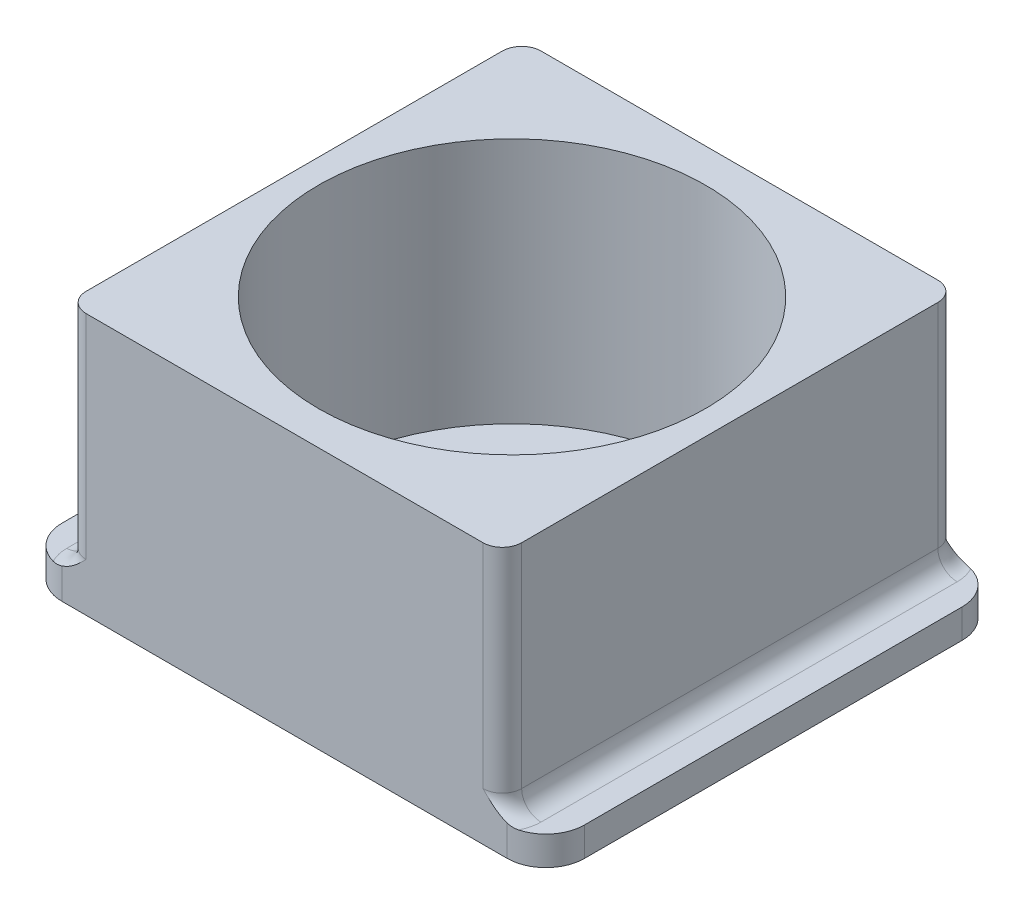
ISO-10303-21;
HEADER;
FILE_DESCRIPTION(('STEP AP214'),'2;1');
FILE_NAME('part.step','',(''),(''),'','','');
FILE_SCHEMA(('AUTOMOTIVE_DESIGN { 1 0 10303 214 1 1 1 1 }'));
ENDSEC;
DATA;
#1=APPLICATION_CONTEXT('core data for automotive mechanical design processes');
#2=APPLICATION_PROTOCOL_DEFINITION('international standard','automotive_design',2000,#1);
#3=PRODUCT_CONTEXT('',#1,'mechanical');
#4=PRODUCT('Part','Part','',(#3));
#5=PRODUCT_RELATED_PRODUCT_CATEGORY('part','',(#4));
#6=PRODUCT_DEFINITION_FORMATION('','',#4);
#7=PRODUCT_DEFINITION_CONTEXT('part definition',#1,'design');
#8=PRODUCT_DEFINITION('design','',#6,#7);
#9=PRODUCT_DEFINITION_SHAPE('','',#8);
#10=(LENGTH_UNIT() NAMED_UNIT(*) SI_UNIT(.MILLI.,.METRE.));
#11=(NAMED_UNIT(*) PLANE_ANGLE_UNIT() SI_UNIT($,.RADIAN.));
#12=(NAMED_UNIT(*) SI_UNIT($,.STERADIAN.) SOLID_ANGLE_UNIT());
#13=UNCERTAINTY_MEASURE_WITH_UNIT(LENGTH_MEASURE(1.E-05),#10,'distance_accuracy_value','');
#14=(GEOMETRIC_REPRESENTATION_CONTEXT(3) GLOBAL_UNCERTAINTY_ASSIGNED_CONTEXT((#13)) GLOBAL_UNIT_ASSIGNED_CONTEXT((#10,
#11,#12)) REPRESENTATION_CONTEXT('',''));
#15=CARTESIAN_POINT('',(0.,0.,0.));
#16=DIRECTION('',(0.,0.,1.));
#17=DIRECTION('',(1.,0.,0.));
#18=AXIS2_PLACEMENT_3D('',#15,#16,#17);
#19=CARTESIAN_POINT('',(0.,1.5,0.));
#20=DIRECTION('',(0.,-1.,0.));
#21=DIRECTION('',(0.,0.,-1.));
#22=AXIS2_PLACEMENT_3D('',#19,#20,#21);
#23=PLANE('',#22);
#24=DIRECTION('',(0.,0.,1.));
#25=VECTOR('',#24,1.);
#26=CARTESIAN_POINT('',(-24.5,1.5,-21.5));
#27=LINE('',#26,#25);
#28=CARTESIAN_POINT('',(-24.5,1.5,21.5));
#29=VERTEX_POINT('',#28);
#30=CARTESIAN_POINT('',(-24.5,1.5,-21.5));
#31=VERTEX_POINT('',#30);
#32=EDGE_CURVE('E264',#29,#31,#27,.F.);
#33=ORIENTED_EDGE('',*,*,#32,.T.);
#34=CARTESIAN_POINT('',(-20.5,1.5,-21.5));
#35=DIRECTION('',(0.,-1.,0.));
#36=DIRECTION('',(0.,0.,-1.));
#37=AXIS2_PLACEMENT_3D('',#34,#35,#36);
#38=CIRCLE('',#37,4.);
#39=CARTESIAN_POINT('',(-24.0399568640095,1.5,-23.3624460800119));
#40=VERTEX_POINT('',#39);
#41=EDGE_CURVE('E268',#31,#40,#38,.T.);
#42=ORIENTED_EDGE('',*,*,#41,.T.);
#43=CARTESIAN_POINT('',(-23.,1.5,-19.5));
#44=DIRECTION('',(0.,-1.,0.));
#45=DIRECTION('',(0.,0.,-1.));
#46=AXIS2_PLACEMENT_3D('',#43,#44,#45);
#47=CIRCLE('',#46,4.);
#48=CARTESIAN_POINT('',(-27.,1.5,-19.5));
#49=VERTEX_POINT('',#48);
#50=EDGE_CURVE('E246',#40,#49,#47,.F.);
#51=ORIENTED_EDGE('',*,*,#50,.T.);
#52=DIRECTION('',(0.,0.,1.));
#53=VECTOR('',#52,1.);
#54=CARTESIAN_POINT('',(-27.,1.5,23.5));
#55=LINE('',#54,#53);
#56=CARTESIAN_POINT('',(-27.,1.5,19.5));
#57=VERTEX_POINT('',#56);
#58=EDGE_CURVE('E216',#49,#57,#55,.T.);
#59=ORIENTED_EDGE('',*,*,#58,.T.);
#60=CARTESIAN_POINT('',(-23.,1.5,19.5));
#61=DIRECTION('',(0.,-1.,0.));
#62=DIRECTION('',(0.,0.,-1.));
#63=AXIS2_PLACEMENT_3D('',#60,#61,#62);
#64=CIRCLE('',#63,4.);
#65=CARTESIAN_POINT('',(-24.0399568640095,1.5,23.3624460800119));
#66=VERTEX_POINT('',#65);
#67=EDGE_CURVE('E248',#57,#66,#64,.F.);
#68=ORIENTED_EDGE('',*,*,#67,.T.);
#69=CARTESIAN_POINT('',(-20.5,1.5,21.5));
#70=DIRECTION('',(0.,-1.,0.));
#71=DIRECTION('',(0.,0.,-1.));
#72=AXIS2_PLACEMENT_3D('',#69,#70,#71);
#73=CIRCLE('',#72,4.);
#74=EDGE_CURVE('E266',#66,#29,#73,.T.);
#75=ORIENTED_EDGE('',*,*,#74,.T.);
#76=EDGE_LOOP('',(#33,#42,#51,#59,#68,#75));
#77=FACE_BOUND('',#76,.T.);
#78=ADVANCED_FACE('F39',(#77),#23,.F.);
#79=DIRECTION('',(0.,0.,-1.));
#80=VECTOR('',#79,1.);
#81=CARTESIAN_POINT('',(24.5,1.5,21.5));
#82=LINE('',#81,#80);
#83=CARTESIAN_POINT('',(24.5,1.5,-21.5));
#84=VERTEX_POINT('',#83);
#85=CARTESIAN_POINT('',(24.5,1.5,21.5));
#86=VERTEX_POINT('',#85);
#87=EDGE_CURVE('E273',#84,#86,#82,.F.);
#88=ORIENTED_EDGE('',*,*,#87,.T.);
#89=CARTESIAN_POINT('',(20.5,1.5,21.5));
#90=DIRECTION('',(0.,-1.,0.));
#91=DIRECTION('',(0.,0.,-1.));
#92=AXIS2_PLACEMENT_3D('',#89,#90,#91);
#93=CIRCLE('',#92,4.);
#94=CARTESIAN_POINT('',(24.0399568640095,1.5,23.3624460800119));
#95=VERTEX_POINT('',#94);
#96=EDGE_CURVE('E277',#86,#95,#93,.T.);
#97=ORIENTED_EDGE('',*,*,#96,.T.);
#98=CARTESIAN_POINT('',(23.,1.5,19.5));
#99=DIRECTION('',(0.,-1.,0.));
#100=DIRECTION('',(0.,0.,-1.));
#101=AXIS2_PLACEMENT_3D('',#98,#99,#100);
#102=CIRCLE('',#101,4.);
#103=CARTESIAN_POINT('',(27.,1.5,19.5));
#104=VERTEX_POINT('',#103);
#105=EDGE_CURVE('E251',#95,#104,#102,.F.);
#106=ORIENTED_EDGE('',*,*,#105,.T.);
#107=DIRECTION('',(0.,0.,-1.));
#108=VECTOR('',#107,1.);
#109=CARTESIAN_POINT('',(27.,1.5,23.5));
#110=LINE('',#109,#108);
#111=CARTESIAN_POINT('',(27.,1.5,-19.5));
#112=VERTEX_POINT('',#111);
#113=EDGE_CURVE('E213',#104,#112,#110,.T.);
#114=ORIENTED_EDGE('',*,*,#113,.T.);
#115=CARTESIAN_POINT('',(23.,1.5,-19.5));
#116=DIRECTION('',(0.,-1.,0.));
#117=DIRECTION('',(0.,0.,-1.));
#118=AXIS2_PLACEMENT_3D('',#115,#116,#117);
#119=CIRCLE('',#118,4.);
#120=CARTESIAN_POINT('',(24.0399568640095,1.5,-23.3624460800119));
#121=VERTEX_POINT('',#120);
#122=EDGE_CURVE('E243',#112,#121,#119,.F.);
#123=ORIENTED_EDGE('',*,*,#122,.T.);
#124=CARTESIAN_POINT('',(20.5,1.5,-21.5));
#125=DIRECTION('',(0.,-1.,0.));
#126=DIRECTION('',(0.,0.,-1.));
#127=AXIS2_PLACEMENT_3D('',#124,#125,#126);
#128=CIRCLE('',#127,4.);
#129=EDGE_CURVE('E275',#121,#84,#128,.T.);
#130=ORIENTED_EDGE('',*,*,#129,.T.);
#131=EDGE_LOOP('',(#88,#97,#106,#114,#123,#130));
#132=FACE_BOUND('',#131,.T.);
#133=ADVANCED_FACE('F420',(#132),#23,.F.);
#134=CARTESIAN_POINT('',(27.,1.5,23.5));
#135=DIRECTION('',(-1.,0.,0.));
#136=DIRECTION('',(0.,0.,1.));
#137=AXIS2_PLACEMENT_3D('',#134,#135,#136);
#138=PLANE('',#137);
#139=ORIENTED_EDGE('',*,*,#113,.F.);
#140=DIRECTION('',(0.,-1.,0.));
#141=VECTOR('',#140,1.);
#142=CARTESIAN_POINT('',(27.,1.5,19.5));
#143=LINE('',#142,#141);
#144=CARTESIAN_POINT('',(27.,-1.5,19.5));
#145=VERTEX_POINT('',#144);
#146=EDGE_CURVE('E228',#104,#145,#143,.T.);
#147=ORIENTED_EDGE('',*,*,#146,.T.);
#148=DIRECTION('',(0.,0.,-1.));
#149=VECTOR('',#148,1.);
#150=CARTESIAN_POINT('',(27.,-1.5,23.5));
#151=LINE('',#150,#149);
#152=CARTESIAN_POINT('',(27.,-1.5,-19.5));
#153=VERTEX_POINT('',#152);
#154=EDGE_CURVE('E204',#145,#153,#151,.T.);
#155=ORIENTED_EDGE('',*,*,#154,.T.);
#156=DIRECTION('',(0.,-1.,0.));
#157=VECTOR('',#156,1.);
#158=CARTESIAN_POINT('',(27.,1.5,-19.5));
#159=LINE('',#158,#157);
#160=EDGE_CURVE('E219',#153,#112,#159,.F.);
#161=ORIENTED_EDGE('',*,*,#160,.T.);
#162=EDGE_LOOP('',(#139,#147,#155,#161));
#163=FACE_BOUND('',#162,.T.);
#164=ADVANCED_FACE('F427',(#163),#138,.F.);
#165=CARTESIAN_POINT('',(-27.,1.5,-23.5));
#166=DIRECTION('',(0.,0.,1.));
#167=DIRECTION('',(1.,0.,0.));
#168=AXIS2_PLACEMENT_3D('',#165,#166,#167);
#169=PLANE('',#168);
#170=DIRECTION('',(-1.,0.,0.));
#171=VECTOR('',#170,1.);
#172=CARTESIAN_POINT('',(-27.,-1.5,-23.5));
#173=LINE('',#172,#171);
#174=CARTESIAN_POINT('',(23.,-1.5,-23.5));
#175=VERTEX_POINT('',#174);
#176=CARTESIAN_POINT('',(-23.,-1.5,-23.5));
#177=VERTEX_POINT('',#176);
#178=EDGE_CURVE('E207',#175,#177,#173,.T.);
#179=ORIENTED_EDGE('',*,*,#178,.T.);
#180=DIRECTION('',(0.,-1.,0.));
#181=VECTOR('',#180,1.);
#182=CARTESIAN_POINT('',(-23.,1.5,-23.5));
#183=LINE('',#182,#181);
#184=CARTESIAN_POINT('',(-23.,1.66628874963058,-23.5));
#185=VERTEX_POINT('',#184);
#186=EDGE_CURVE('E259',#177,#185,#183,.F.);
#187=ORIENTED_EDGE('',*,*,#186,.T.);
#188=CARTESIAN_POINT('',(-23.,1.66628874963058,-23.5));
#189=CARTESIAN_POINT('',(-22.8903338642382,1.70356250926023,-23.5));
#190=CARTESIAN_POINT('',(-22.7826803848652,1.74635232247954,-23.5));
#191=CARTESIAN_POINT('',(-22.5718897609288,1.84132053066929,-23.5));
#192=CARTESIAN_POINT('',(-22.4687423031175,1.89347592061837,-23.5));
#193=CARTESIAN_POINT('',(-22.2683174790698,2.00495052222373,-23.5));
#194=CARTESIAN_POINT('',(-22.1709786298475,2.06416060113332,-23.5));
#195=CARTESIAN_POINT('',(-21.9804356063367,2.18898314644126,-23.5));
#196=CARTESIAN_POINT('',(-21.88723407996,2.25459962943152,-23.5));
#197=CARTESIAN_POINT('',(-21.5635987666961,2.49631618751722,-23.5));
#198=CARTESIAN_POINT('',(-21.3437215683705,2.68642031146553,-23.5));
#199=CARTESIAN_POINT('',(-20.9179514379764,3.08218010252362,-23.5));
#200=CARTESIAN_POINT('',(-20.712111876492,3.28788945320796,-23.5));
#201=CARTESIAN_POINT('',(-20.5042163726082,3.49578362961498,-23.5));
#202=CARTESIAN_POINT('',(-20.5021081875281,3.49789181476138,-23.5));
#203=CARTESIAN_POINT('',(-20.5,3.5,-23.5));
#204=B_SPLINE_CURVE_WITH_KNOTS('',3,(#188,#189,#190,#191,#192,#193,#194,#195,#196,#197,#198,
#199,#200,#201,#202,#203),.UNSPECIFIED.,.F.,.F.,(4,2,2,2,2,2,2,4),(0.,0.347146339553688,
0.693451352811269,1.03496369302453,1.37669154158688,2.2466292117518,3.11970858153595,
3.12865285345887),.UNSPECIFIED.);
#205=CARTESIAN_POINT('',(-20.5,3.5,-23.5));
#206=VERTEX_POINT('',#205);
#207=EDGE_CURVE('E294',#185,#206,#204,.T.);
#208=ORIENTED_EDGE('',*,*,#207,.T.);
#209=DIRECTION('',(0.,-1.,0.));
#210=VECTOR('',#209,1.);
#211=CARTESIAN_POINT('',(-20.5,25.5,-23.5));
#212=LINE('',#211,#210);
#213=CARTESIAN_POINT('',(-20.5,25.5,-23.5));
#214=VERTEX_POINT('',#213);
#215=EDGE_CURVE('E370',#214,#206,#212,.T.);
#216=ORIENTED_EDGE('',*,*,#215,.F.);
#217=DIRECTION('',(-1.,0.,0.));
#218=VECTOR('',#217,1.);
#219=CARTESIAN_POINT('',(-20.5,25.5,-23.5));
#220=LINE('',#219,#218);
#221=CARTESIAN_POINT('',(20.5,25.5,-23.5));
#222=VERTEX_POINT('',#221);
#223=EDGE_CURVE('E350',#222,#214,#220,.T.);
#224=ORIENTED_EDGE('',*,*,#223,.F.);
#225=DIRECTION('',(0.,-1.,0.));
#226=VECTOR('',#225,1.);
#227=CARTESIAN_POINT('',(20.5,25.5,-23.5));
#228=LINE('',#227,#226);
#229=CARTESIAN_POINT('',(20.5,3.5,-23.5));
#230=VERTEX_POINT('',#229);
#231=EDGE_CURVE('E209',#222,#230,#228,.T.);
#232=ORIENTED_EDGE('',*,*,#231,.T.);
#233=CARTESIAN_POINT('',(23.,1.66628874963057,-23.5));
#234=CARTESIAN_POINT('',(22.8903338642376,1.7035625092604,-23.5));
#235=CARTESIAN_POINT('',(22.7826803848641,1.74635232247996,-23.5));
#236=CARTESIAN_POINT('',(22.5718897609268,1.84132053067026,-23.5));
#237=CARTESIAN_POINT('',(22.4687423031151,1.89347592061961,-23.5));
#238=CARTESIAN_POINT('',(22.2683174790676,2.00495052222504,-23.5));
#239=CARTESIAN_POINT('',(22.1709786298458,2.06416060113436,-23.5));
#240=CARTESIAN_POINT('',(21.980435606336,2.18898314644187,-23.5));
#241=CARTESIAN_POINT('',(21.8872340799598,2.254599629432,-23.5));
#242=CARTESIAN_POINT('',(21.5635987666958,2.49631618751664,-23.5));
#243=CARTESIAN_POINT('',(21.3437215683678,2.68642031146232,-23.5));
#244=CARTESIAN_POINT('',(20.9179514379797,3.08218010252629,-23.5));
#245=CARTESIAN_POINT('',(20.7121118765035,3.28788945321918,-23.5));
#246=CARTESIAN_POINT('',(20.5042163726085,3.49578362961522,-23.5));
#247=CARTESIAN_POINT('',(20.5021081875282,3.4978918147615,-23.5));
#248=CARTESIAN_POINT('',(20.5,3.5,-23.5));
#249=B_SPLINE_CURVE_WITH_KNOTS('',3,(#233,#234,#235,#236,#237,#238,#239,#240,#241,#242,#243,
#244,#245,#246,#247,#248),.UNSPECIFIED.,.F.,.F.,(4,2,2,2,2,2,2,4),(0.,0.347146339555444,
0.693451352814415,1.034963693026,1.37669154158688,2.24662921175119,3.11970858153597,
3.12865285345887),.UNSPECIFIED.);
#250=CARTESIAN_POINT('',(23.,1.66628874963057,-23.5));
#251=VERTEX_POINT('',#250);
#252=EDGE_CURVE('E49',#230,#251,#249,.F.);
#253=ORIENTED_EDGE('',*,*,#252,.T.);
#254=DIRECTION('',(0.,-1.,0.));
#255=VECTOR('',#254,1.);
#256=CARTESIAN_POINT('',(23.,1.5,-23.5));
#257=LINE('',#256,#255);
#258=EDGE_CURVE('E56',#251,#175,#257,.T.);
#259=ORIENTED_EDGE('',*,*,#258,.T.);
#260=EDGE_LOOP('',(#179,#187,#208,#216,#224,#232,#253,#259));
#261=FACE_BOUND('',#260,.T.);
#262=ADVANCED_FACE('F377',(#261),#169,.F.);
#263=CARTESIAN_POINT('',(-27.,1.5,23.5));
#264=DIRECTION('',(1.,0.,0.));
#265=DIRECTION('',(0.,0.,-1.));
#266=AXIS2_PLACEMENT_3D('',#263,#264,#265);
#267=PLANE('',#266);
#268=DIRECTION('',(0.,0.,1.));
#269=VECTOR('',#268,1.);
#270=CARTESIAN_POINT('',(-27.,-1.5,23.5));
#271=LINE('',#270,#269);
#272=CARTESIAN_POINT('',(-27.,-1.5,-19.5));
#273=VERTEX_POINT('',#272);
#274=CARTESIAN_POINT('',(-27.,-1.5,19.5));
#275=VERTEX_POINT('',#274);
#276=EDGE_CURVE('E223',#273,#275,#271,.T.);
#277=ORIENTED_EDGE('',*,*,#276,.T.);
#278=DIRECTION('',(0.,-1.,0.));
#279=VECTOR('',#278,1.);
#280=CARTESIAN_POINT('',(-27.,1.5,19.5));
#281=LINE('',#280,#279);
#282=EDGE_CURVE('E256',#275,#57,#281,.F.);
#283=ORIENTED_EDGE('',*,*,#282,.T.);
#284=ORIENTED_EDGE('',*,*,#58,.F.);
#285=DIRECTION('',(0.,-1.,0.));
#286=VECTOR('',#285,1.);
#287=CARTESIAN_POINT('',(-27.,1.5,-19.5));
#288=LINE('',#287,#286);
#289=EDGE_CURVE('E253',#49,#273,#288,.T.);
#290=ORIENTED_EDGE('',*,*,#289,.T.);
#291=EDGE_LOOP('',(#277,#283,#284,#290));
#292=FACE_BOUND('',#291,.T.);
#293=ADVANCED_FACE('F442',(#292),#267,.F.);
#294=CARTESIAN_POINT('',(-27.,1.5,23.5));
#295=DIRECTION('',(0.,0.,-1.));
#296=DIRECTION('',(-1.,0.,0.));
#297=AXIS2_PLACEMENT_3D('',#294,#295,#296);
#298=PLANE('',#297);
#299=DIRECTION('',(1.,0.,0.));
#300=VECTOR('',#299,1.);
#301=CARTESIAN_POINT('',(-27.,-1.5,23.5));
#302=LINE('',#301,#300);
#303=CARTESIAN_POINT('',(-23.,-1.5,23.5));
#304=VERTEX_POINT('',#303);
#305=CARTESIAN_POINT('',(23.,-1.5,23.5));
#306=VERTEX_POINT('',#305);
#307=EDGE_CURVE('E217',#304,#306,#302,.T.);
#308=ORIENTED_EDGE('',*,*,#307,.T.);
#309=DIRECTION('',(0.,-1.,0.));
#310=VECTOR('',#309,1.);
#311=CARTESIAN_POINT('',(23.,1.5,23.5));
#312=LINE('',#311,#310);
#313=CARTESIAN_POINT('',(23.,1.66628874963058,23.5));
#314=VERTEX_POINT('',#313);
#315=EDGE_CURVE('E64',#306,#314,#312,.F.);
#316=ORIENTED_EDGE('',*,*,#315,.T.);
#317=CARTESIAN_POINT('',(23.,1.66628874963058,23.5));
#318=CARTESIAN_POINT('',(22.8903338642357,1.70356250926099,23.5));
#319=CARTESIAN_POINT('',(22.7826803848604,1.74635232248141,23.5));
#320=CARTESIAN_POINT('',(22.57188976092,1.84132053067354,23.5));
#321=CARTESIAN_POINT('',(22.4687423031071,1.89347592062385,23.5));
#322=CARTESIAN_POINT('',(22.26831747906,2.00495052222951,23.5));
#323=CARTESIAN_POINT('',(22.1709786298398,2.06416060113788,23.5));
#324=CARTESIAN_POINT('',(21.9804356063334,2.18898314644396,23.5));
#325=CARTESIAN_POINT('',(21.887234079959,2.25459962943361,23.5));
#326=CARTESIAN_POINT('',(21.5635987666948,2.49631618751467,23.5));
#327=CARTESIAN_POINT('',(21.343721568359,2.68642031145144,23.5));
#328=CARTESIAN_POINT('',(20.9179514379907,3.0821801025353,23.5));
#329=CARTESIAN_POINT('',(20.7121118765425,3.2878894532572,23.4999999999999));
#330=CARTESIAN_POINT('',(20.5042163726092,3.495783629616,23.5));
#331=CARTESIAN_POINT('',(20.5021081875286,3.49789181476189,23.5));
#332=CARTESIAN_POINT('',(20.5,3.5,23.5));
#333=B_SPLINE_CURVE_WITH_KNOTS('',3,(#317,#318,#319,#320,#321,#322,#323,#324,#325,#326,#327,
#328,#329,#330,#331,#332),.UNSPECIFIED.,.F.,.F.,(4,2,2,2,2,2,2,4),(0.,0.34714633956139,
0.693451352825081,1.034963693031,1.37669154158687,2.24662921174907,3.11970858153593,
3.12865285345884),.UNSPECIFIED.);
#334=CARTESIAN_POINT('',(20.5,3.5,23.5));
#335=VERTEX_POINT('',#334);
#336=EDGE_CURVE('E385',#314,#335,#333,.T.);
#337=ORIENTED_EDGE('',*,*,#336,.T.);
#338=DIRECTION('',(0.,-1.,0.));
#339=VECTOR('',#338,1.);
#340=CARTESIAN_POINT('',(20.5,25.5,23.5));
#341=LINE('',#340,#339);
#342=CARTESIAN_POINT('',(20.5,25.5,23.5));
#343=VERTEX_POINT('',#342);
#344=EDGE_CURVE('E359',#343,#335,#341,.T.);
#345=ORIENTED_EDGE('',*,*,#344,.F.);
#346=DIRECTION('',(1.,0.,0.));
#347=VECTOR('',#346,1.);
#348=CARTESIAN_POINT('',(-20.5,25.5,23.5));
#349=LINE('',#348,#347);
#350=CARTESIAN_POINT('',(-20.5,25.5,23.5));
#351=VERTEX_POINT('',#350);
#352=EDGE_CURVE('E194',#351,#343,#349,.T.);
#353=ORIENTED_EDGE('',*,*,#352,.F.);
#354=DIRECTION('',(0.,-1.,0.));
#355=VECTOR('',#354,1.);
#356=CARTESIAN_POINT('',(-20.5,25.5,23.5));
#357=LINE('',#356,#355);
#358=CARTESIAN_POINT('',(-20.5,3.5,23.5));
#359=VERTEX_POINT('',#358);
#360=EDGE_CURVE('E361',#351,#359,#357,.T.);
#361=ORIENTED_EDGE('',*,*,#360,.T.);
#362=CARTESIAN_POINT('',(-23.,1.66628874963058,23.5));
#363=CARTESIAN_POINT('',(-22.8903338642362,1.70356250926084,23.5));
#364=CARTESIAN_POINT('',(-22.7826803848614,1.74635232248104,23.5));
#365=CARTESIAN_POINT('',(-22.5718897609218,1.8413205306727,23.5));
#366=CARTESIAN_POINT('',(-22.4687423031091,1.89347592062276,23.5));
#367=CARTESIAN_POINT('',(-22.268317479062,2.00495052222837,23.5));
#368=CARTESIAN_POINT('',(-22.1709786298413,2.06416060113697,23.5));
#369=CARTESIAN_POINT('',(-21.9804356063341,2.18898314644342,23.5));
#370=CARTESIAN_POINT('',(-21.8872340799592,2.25459962943319,23.5));
#371=CARTESIAN_POINT('',(-21.5635987666951,2.49631618751517,23.5));
#372=CARTESIAN_POINT('',(-21.3437215683612,2.68642031145423,23.5));
#373=CARTESIAN_POINT('',(-20.9179514379879,3.08218010253298,23.5));
#374=CARTESIAN_POINT('',(-20.7121118765325,3.28788945324743,23.4999999999999));
#375=CARTESIAN_POINT('',(-20.504216372609,3.4957836296158,23.5));
#376=CARTESIAN_POINT('',(-20.5021081875285,3.49789181476179,23.5));
#377=CARTESIAN_POINT('',(-20.5,3.5,23.5));
#378=B_SPLINE_CURVE_WITH_KNOTS('',3,(#362,#363,#364,#365,#366,#367,#368,#369,#370,#371,#372,
#373,#374,#375,#376,#377),.UNSPECIFIED.,.F.,.F.,(4,2,2,2,2,2,2,4),(0.,0.347146339559859,
0.693451352822337,1.03496369302971,1.37669154158687,2.24662921174961,3.11970858153593,
3.12865285345884),.UNSPECIFIED.);
#379=CARTESIAN_POINT('',(-23.,1.66628874963058,23.5));
#380=VERTEX_POINT('',#379);
#381=EDGE_CURVE('E496',#359,#380,#378,.F.);
#382=ORIENTED_EDGE('',*,*,#381,.T.);
#383=DIRECTION('',(0.,-1.,0.));
#384=VECTOR('',#383,1.);
#385=CARTESIAN_POINT('',(-23.,1.5,23.5));
#386=LINE('',#385,#384);
#387=EDGE_CURVE('E239',#380,#304,#386,.T.);
#388=ORIENTED_EDGE('',*,*,#387,.T.);
#389=EDGE_LOOP('',(#308,#316,#337,#345,#353,#361,#382,#388));
#390=FACE_BOUND('',#389,.T.);
#391=ADVANCED_FACE('F401',(#390),#298,.F.);
#392=CARTESIAN_POINT('',(0.,-1.5,0.));
#393=DIRECTION('',(0.,-1.,0.));
#394=DIRECTION('',(0.,0.,-1.));
#395=AXIS2_PLACEMENT_3D('',#392,#393,#394);
#396=PLANE('',#395);
#397=CARTESIAN_POINT('',(0.,-1.5,0.));
#398=DIRECTION('',(0.,1.,0.));
#399=DIRECTION('',(0.,0.,1.));
#400=AXIS2_PLACEMENT_3D('',#397,#398,#399);
#401=CIRCLE('',#400,10.);
#402=CARTESIAN_POINT('',(0.,-1.5,10.));
#403=VERTEX_POINT('',#402);
#404=EDGE_CURVE('E343',#403,#403,#401,.T.);
#405=ORIENTED_EDGE('',*,*,#404,.T.);
#406=EDGE_LOOP('',(#405));
#407=FACE_BOUND('',#406,.T.);
#408=ORIENTED_EDGE('',*,*,#154,.F.);
#409=CARTESIAN_POINT('',(23.,-1.5,19.5));
#410=DIRECTION('',(0.,-1.,0.));
#411=DIRECTION('',(0.,0.,-1.));
#412=AXIS2_PLACEMENT_3D('',#409,#410,#411);
#413=CIRCLE('',#412,4.);
#414=EDGE_CURVE('E237',#145,#306,#413,.T.);
#415=ORIENTED_EDGE('',*,*,#414,.T.);
#416=ORIENTED_EDGE('',*,*,#307,.F.);
#417=CARTESIAN_POINT('',(-23.,-1.5,19.5));
#418=DIRECTION('',(0.,-1.,0.));
#419=DIRECTION('',(0.,0.,-1.));
#420=AXIS2_PLACEMENT_3D('',#417,#418,#419);
#421=CIRCLE('',#420,4.);
#422=EDGE_CURVE('E235',#304,#275,#421,.T.);
#423=ORIENTED_EDGE('',*,*,#422,.T.);
#424=ORIENTED_EDGE('',*,*,#276,.F.);
#425=CARTESIAN_POINT('',(-23.,-1.5,-19.5));
#426=DIRECTION('',(0.,-1.,0.));
#427=DIRECTION('',(0.,0.,-1.));
#428=AXIS2_PLACEMENT_3D('',#425,#426,#427);
#429=CIRCLE('',#428,4.);
#430=EDGE_CURVE('E233',#273,#177,#429,.T.);
#431=ORIENTED_EDGE('',*,*,#430,.T.);
#432=ORIENTED_EDGE('',*,*,#178,.F.);
#433=CARTESIAN_POINT('',(23.,-1.5,-19.5));
#434=DIRECTION('',(0.,-1.,0.));
#435=DIRECTION('',(0.,0.,-1.));
#436=AXIS2_PLACEMENT_3D('',#433,#434,#435);
#437=CIRCLE('',#436,4.);
#438=EDGE_CURVE('E231',#175,#153,#437,.T.);
#439=ORIENTED_EDGE('',*,*,#438,.T.);
#440=EDGE_LOOP('',(#408,#415,#416,#423,#424,#431,#432,#439));
#441=FACE_BOUND('',#440,.T.);
#442=ADVANCED_FACE('F431',(#407,#441),#396,.T.);
#443=CARTESIAN_POINT('',(23.,1.5,19.5));
#444=DIRECTION('',(0.,-1.,0.));
#445=DIRECTION('',(0.,0.,-1.));
#446=AXIS2_PLACEMENT_3D('',#443,#444,#445);
#447=CYLINDRICAL_SURFACE('',#446,4.);
#448=ORIENTED_EDGE('',*,*,#105,.F.);
#449=CARTESIAN_POINT('',(24.0399568640095,1.5,23.3624460800119));
#450=CARTESIAN_POINT('',(23.9698240876217,1.50000001642399,23.3813436911759));
#451=CARTESIAN_POINT('',(23.8991559078275,1.50212890225138,23.3983082333179));
#452=CARTESIAN_POINT('',(23.7571940093544,1.51086009385949,23.4283452593107));
#453=CARTESIAN_POINT('',(23.6858997057404,1.51746715097721,23.4414135880551));
#454=CARTESIAN_POINT('',(23.5445480600626,1.53521234096278,23.4633950521013));
#455=CARTESIAN_POINT('',(23.4744912283006,1.546267950106,23.4723778367474));
#456=CARTESIAN_POINT('',(23.3349470337689,1.57309228579254,23.4865674270324));
#457=CARTESIAN_POINT('',(23.2654592384314,1.58885700728089,23.4917774285451));
#458=CARTESIAN_POINT('',(23.1635541159242,1.61577855705873,23.496791649555));
#459=CARTESIAN_POINT('',(23.1306946420752,1.62505365186932,23.497998066726));
#460=CARTESIAN_POINT('',(23.0651581132822,1.64478425512921,23.4996041819657));
#461=CARTESIAN_POINT('',(23.0324824485261,1.65524466363393,23.5000003919733));
#462=CARTESIAN_POINT('',(23.,1.66628874963037,23.5000000000001));
#463=B_SPLINE_CURVE_WITH_KNOTS('',3,(#449,#450,#451,#452,#453,#454,#455,#456,#457,#458,#459,
#460,#461,#462),.UNSPECIFIED.,.F.,.F.,(4,2,2,2,2,2,4),(0.,0.217866449812925,0.435964418396976,
0.650190438956059,0.86423477858804,0.966703106805048,1.06961165534549),.UNSPECIFIED.);
#464=EDGE_CURVE('E386',#95,#314,#463,.T.);
#465=ORIENTED_EDGE('',*,*,#464,.T.);
#466=ORIENTED_EDGE('',*,*,#315,.F.);
#467=ORIENTED_EDGE('',*,*,#414,.F.);
#468=ORIENTED_EDGE('',*,*,#146,.F.);
#469=EDGE_LOOP('',(#448,#465,#466,#467,#468));
#470=FACE_BOUND('',#469,.T.);
#471=ADVANCED_FACE('F433',(#470),#447,.T.);
#472=CARTESIAN_POINT('',(-23.,1.5,19.5));
#473=DIRECTION('',(0.,-1.,0.));
#474=DIRECTION('',(0.,0.,-1.));
#475=AXIS2_PLACEMENT_3D('',#472,#473,#474);
#476=CYLINDRICAL_SURFACE('',#475,4.);
#477=ORIENTED_EDGE('',*,*,#67,.F.);
#478=ORIENTED_EDGE('',*,*,#282,.F.);
#479=ORIENTED_EDGE('',*,*,#422,.F.);
#480=ORIENTED_EDGE('',*,*,#387,.F.);
#481=CARTESIAN_POINT('',(-23.,1.66628874963058,23.5));
#482=CARTESIAN_POINT('',(-23.0688006054759,1.64289347508008,23.5000175936537));
#483=CARTESIAN_POINT('',(-23.1384768491733,1.62211994641261,23.4982257322865));
#484=CARTESIAN_POINT('',(-23.2789508840957,1.58562999507363,23.4908764754229));
#485=CARTESIAN_POINT('',(-23.3497487095902,1.56991372723878,23.4853189646509));
#486=CARTESIAN_POINT('',(-23.4906412835135,1.54357588810128,23.4704176883739));
#487=CARTESIAN_POINT('',(-23.5607279297792,1.53287334764138,23.4611389387245));
#488=CARTESIAN_POINT('',(-23.7008050214607,1.51598400010114,23.4387683150824));
#489=CARTESIAN_POINT('',(-23.7707954976745,1.5097948991309,23.4256783828079));
#490=CARTESIAN_POINT('',(-23.8738291194858,1.50382866265353,23.4035353197646));
#491=CARTESIAN_POINT('',(-23.9071033031971,1.50239089167915,23.3959375585193));
#492=CARTESIAN_POINT('',(-23.973608279753,1.50047473533557,23.3798533311209));
#493=CARTESIAN_POINT('',(-24.006838338429,1.50000029816985,23.371363357035));
#494=CARTESIAN_POINT('',(-24.0399568640095,1.5,23.3624460800119));
#495=B_SPLINE_CURVE_WITH_KNOTS('',3,(#481,#482,#483,#484,#485,#486,#487,#488,#489,#490,#491,
#492,#493,#494),.UNSPECIFIED.,.F.,.F.,(4,2,2,2,2,2,4),(0.,0.217913203233139,0.435833077615348,
0.650100772083153,0.86425949207738,0.966721210010184,1.0696020243463),.UNSPECIFIED.);
#496=EDGE_CURVE('E388',#380,#66,#495,.T.);
#497=ORIENTED_EDGE('',*,*,#496,.T.);
#498=EDGE_LOOP('',(#477,#478,#479,#480,#497));
#499=FACE_BOUND('',#498,.T.);
#500=ADVANCED_FACE('F310',(#499),#476,.T.);
#501=CARTESIAN_POINT('',(-23.,1.5,-19.5));
#502=DIRECTION('',(0.,-1.,0.));
#503=DIRECTION('',(0.,0.,-1.));
#504=AXIS2_PLACEMENT_3D('',#501,#502,#503);
#505=CYLINDRICAL_SURFACE('',#504,4.);
#506=ORIENTED_EDGE('',*,*,#50,.F.);
#507=CARTESIAN_POINT('',(-24.0399568640095,1.5,-23.3624460800119));
#508=CARTESIAN_POINT('',(-23.9698240876217,1.50000001642399,-23.3813436911759));
#509=CARTESIAN_POINT('',(-23.8991559078275,1.50212890225138,-23.3983082333179));
#510=CARTESIAN_POINT('',(-23.7571940093544,1.51086009385949,-23.4283452593107));
#511=CARTESIAN_POINT('',(-23.6858997057404,1.51746715097722,-23.4414135880551));
#512=CARTESIAN_POINT('',(-23.5445480600625,1.53521234096278,-23.4633950521013));
#513=CARTESIAN_POINT('',(-23.4744912283006,1.546267950106,-23.4723778367474));
#514=CARTESIAN_POINT('',(-23.3349470337689,1.57309228579254,-23.4865674270324));
#515=CARTESIAN_POINT('',(-23.2654592384314,1.58885700728089,-23.4917774285451));
#516=CARTESIAN_POINT('',(-23.1635541159242,1.61577855705873,-23.496791649555));
#517=CARTESIAN_POINT('',(-23.1306946420752,1.62505365186932,-23.497998066726));
#518=CARTESIAN_POINT('',(-23.0651581132822,1.64478425512921,-23.4996041819657));
#519=CARTESIAN_POINT('',(-23.0324824485261,1.65524466363393,-23.5000003919733));
#520=CARTESIAN_POINT('',(-23.,1.66628874963037,-23.5000000000001));
#521=B_SPLINE_CURVE_WITH_KNOTS('',3,(#507,#508,#509,#510,#511,#512,#513,#514,#515,#516,#517,
#518,#519,#520),.UNSPECIFIED.,.F.,.F.,(4,2,2,2,2,2,4),(0.,0.217866449812925,0.435964418396983,
0.650190438956062,0.864234778588044,0.966703106805048,1.06961165534549),.UNSPECIFIED.);
#522=EDGE_CURVE('E285',#40,#185,#521,.T.);
#523=ORIENTED_EDGE('',*,*,#522,.T.);
#524=ORIENTED_EDGE('',*,*,#186,.F.);
#525=ORIENTED_EDGE('',*,*,#430,.F.);
#526=ORIENTED_EDGE('',*,*,#289,.F.);
#527=EDGE_LOOP('',(#506,#523,#524,#525,#526));
#528=FACE_BOUND('',#527,.T.);
#529=ADVANCED_FACE('F305',(#528),#505,.T.);
#530=CARTESIAN_POINT('',(23.,1.5,-19.5));
#531=DIRECTION('',(0.,-1.,0.));
#532=DIRECTION('',(0.,0.,-1.));
#533=AXIS2_PLACEMENT_3D('',#530,#531,#532);
#534=CYLINDRICAL_SURFACE('',#533,4.);
#535=ORIENTED_EDGE('',*,*,#122,.F.);
#536=ORIENTED_EDGE('',*,*,#160,.F.);
#537=ORIENTED_EDGE('',*,*,#438,.F.);
#538=ORIENTED_EDGE('',*,*,#258,.F.);
#539=CARTESIAN_POINT('',(23.,1.66628874963057,-23.5));
#540=CARTESIAN_POINT('',(23.0688006054759,1.64289347508007,-23.5000175936537));
#541=CARTESIAN_POINT('',(23.1384768491733,1.62211994641261,-23.4982257322865));
#542=CARTESIAN_POINT('',(23.2789508840957,1.58562999507363,-23.4908764754229));
#543=CARTESIAN_POINT('',(23.3497487095902,1.56991372723878,-23.4853189646509));
#544=CARTESIAN_POINT('',(23.4906412835135,1.54357588810128,-23.4704176883739));
#545=CARTESIAN_POINT('',(23.5607279297792,1.53287334764138,-23.4611389387245));
#546=CARTESIAN_POINT('',(23.7008050214607,1.51598400010113,-23.4387683150824));
#547=CARTESIAN_POINT('',(23.7707954976745,1.5097948991309,-23.4256783828079));
#548=CARTESIAN_POINT('',(23.8738291194858,1.50382866265353,-23.4035353197646));
#549=CARTESIAN_POINT('',(23.9071033031971,1.50239089167915,-23.3959375585193));
#550=CARTESIAN_POINT('',(23.973608279753,1.50047473533557,-23.3798533311209));
#551=CARTESIAN_POINT('',(24.006838338429,1.50000029816985,-23.371363357035));
#552=CARTESIAN_POINT('',(24.0399568640095,1.5,-23.3624460800119));
#553=B_SPLINE_CURVE_WITH_KNOTS('',3,(#539,#540,#541,#542,#543,#544,#545,#546,#547,#548,#549,
#550,#551,#552),.UNSPECIFIED.,.F.,.F.,(4,2,2,2,2,2,4),(0.,0.217913203233142,0.435833077615352,
0.650100772083153,0.864259492077379,0.966721210010173,1.06960202434629),.UNSPECIFIED.);
#554=EDGE_CURVE('E11',#251,#121,#553,.T.);
#555=ORIENTED_EDGE('',*,*,#554,.T.);
#556=EDGE_LOOP('',(#535,#536,#537,#538,#555));
#557=FACE_BOUND('',#556,.T.);
#558=ADVANCED_FACE('F309',(#557),#534,.T.);
#559=CARTESIAN_POINT('',(20.5,25.5,21.5));
#560=DIRECTION('',(0.,-1.,0.));
#561=DIRECTION('',(0.,0.,-1.));
#562=AXIS2_PLACEMENT_3D('',#559,#560,#561);
#563=CYLINDRICAL_SURFACE('',#562,2.);
#564=ORIENTED_EDGE('',*,*,#344,.T.);
#565=CARTESIAN_POINT('',(20.5,3.5,21.5));
#566=DIRECTION('',(0.,-1.,0.));
#567=DIRECTION('',(0.,0.,-1.));
#568=AXIS2_PLACEMENT_3D('',#565,#566,#567);
#569=CIRCLE('',#568,2.);
#570=CARTESIAN_POINT('',(22.5,3.5,21.5));
#571=VERTEX_POINT('',#570);
#572=EDGE_CURVE('E203',#335,#571,#569,.F.);
#573=ORIENTED_EDGE('',*,*,#572,.T.);
#574=DIRECTION('',(0.,-1.,0.));
#575=VECTOR('',#574,1.);
#576=CARTESIAN_POINT('',(22.5,25.5,21.5));
#577=LINE('',#576,#575);
#578=CARTESIAN_POINT('',(22.5,25.5,21.5));
#579=VERTEX_POINT('',#578);
#580=EDGE_CURVE('E183',#579,#571,#577,.T.);
#581=ORIENTED_EDGE('',*,*,#580,.F.);
#582=CARTESIAN_POINT('',(20.5,25.5,21.5));
#583=DIRECTION('',(0.,1.,0.));
#584=DIRECTION('',(0.,0.,1.));
#585=AXIS2_PLACEMENT_3D('',#582,#583,#584);
#586=CIRCLE('',#585,2.);
#587=EDGE_CURVE('E189',#343,#579,#586,.T.);
#588=ORIENTED_EDGE('',*,*,#587,.F.);
#589=EDGE_LOOP('',(#564,#573,#581,#588));
#590=FACE_BOUND('',#589,.T.);
#591=ADVANCED_FACE('F201',(#590),#563,.T.);
#592=CARTESIAN_POINT('',(22.5,25.5,21.5));
#593=DIRECTION('',(-1.,0.,0.));
#594=DIRECTION('',(0.,0.,1.));
#595=AXIS2_PLACEMENT_3D('',#592,#593,#594);
#596=PLANE('',#595);
#597=ORIENTED_EDGE('',*,*,#580,.T.);
#598=DIRECTION('',(0.,0.,-1.));
#599=VECTOR('',#598,1.);
#600=CARTESIAN_POINT('',(22.5,3.5,-21.5));
#601=LINE('',#600,#599);
#602=CARTESIAN_POINT('',(22.5,3.5,-21.5));
#603=VERTEX_POINT('',#602);
#604=EDGE_CURVE('E283',#571,#603,#601,.T.);
#605=ORIENTED_EDGE('',*,*,#604,.T.);
#606=DIRECTION('',(0.,-1.,0.));
#607=VECTOR('',#606,1.);
#608=CARTESIAN_POINT('',(22.5,25.5,-21.5));
#609=LINE('',#608,#607);
#610=CARTESIAN_POINT('',(22.5,25.5,-21.5));
#611=VERTEX_POINT('',#610);
#612=EDGE_CURVE('E185',#611,#603,#609,.T.);
#613=ORIENTED_EDGE('',*,*,#612,.F.);
#614=DIRECTION('',(0.,0.,-1.));
#615=VECTOR('',#614,1.);
#616=CARTESIAN_POINT('',(22.5,25.5,21.5));
#617=LINE('',#616,#615);
#618=EDGE_CURVE('E179',#579,#611,#617,.T.);
#619=ORIENTED_EDGE('',*,*,#618,.F.);
#620=EDGE_LOOP('',(#597,#605,#613,#619));
#621=FACE_BOUND('',#620,.T.);
#622=ADVANCED_FACE('F181',(#621),#596,.F.);
#623=CARTESIAN_POINT('',(20.5,25.5,-21.5));
#624=DIRECTION('',(0.,-1.,0.));
#625=DIRECTION('',(0.,0.,-1.));
#626=AXIS2_PLACEMENT_3D('',#623,#624,#625);
#627=CYLINDRICAL_SURFACE('',#626,2.);
#628=ORIENTED_EDGE('',*,*,#612,.T.);
#629=CARTESIAN_POINT('',(20.5,3.5,-21.5));
#630=DIRECTION('',(0.,-1.,0.));
#631=DIRECTION('',(0.,0.,-1.));
#632=AXIS2_PLACEMENT_3D('',#629,#630,#631);
#633=CIRCLE('',#632,2.);
#634=EDGE_CURVE('E279',#603,#230,#633,.F.);
#635=ORIENTED_EDGE('',*,*,#634,.T.);
#636=ORIENTED_EDGE('',*,*,#231,.F.);
#637=CARTESIAN_POINT('',(20.5,25.5,-21.5));
#638=DIRECTION('',(0.,1.,0.));
#639=DIRECTION('',(0.,0.,-1.));
#640=AXIS2_PLACEMENT_3D('',#637,#638,#639);
#641=CIRCLE('',#640,2.);
#642=EDGE_CURVE('E188',#611,#222,#641,.T.);
#643=ORIENTED_EDGE('',*,*,#642,.F.);
#644=EDGE_LOOP('',(#628,#635,#636,#643));
#645=FACE_BOUND('',#644,.T.);
#646=ADVANCED_FACE('F457',(#645),#627,.T.);
#647=CARTESIAN_POINT('',(-20.5,25.5,-21.5));
#648=DIRECTION('',(0.,-1.,0.));
#649=DIRECTION('',(0.,0.,-1.));
#650=AXIS2_PLACEMENT_3D('',#647,#648,#649);
#651=CYLINDRICAL_SURFACE('',#650,2.);
#652=ORIENTED_EDGE('',*,*,#215,.T.);
#653=CARTESIAN_POINT('',(-20.5,3.5,-21.5));
#654=DIRECTION('',(0.,-1.,0.));
#655=DIRECTION('',(0.,0.,-1.));
#656=AXIS2_PLACEMENT_3D('',#653,#654,#655);
#657=CIRCLE('',#656,2.);
#658=CARTESIAN_POINT('',(-22.5,3.5,-21.5));
#659=VERTEX_POINT('',#658);
#660=EDGE_CURVE('E261',#206,#659,#657,.F.);
#661=ORIENTED_EDGE('',*,*,#660,.T.);
#662=DIRECTION('',(0.,-1.,0.));
#663=VECTOR('',#662,1.);
#664=CARTESIAN_POINT('',(-22.5,25.5,-21.5));
#665=LINE('',#664,#663);
#666=CARTESIAN_POINT('',(-22.5,25.5,-21.5));
#667=VERTEX_POINT('',#666);
#668=EDGE_CURVE('E367',#667,#659,#665,.T.);
#669=ORIENTED_EDGE('',*,*,#668,.F.);
#670=CARTESIAN_POINT('',(-20.5,25.5,-21.5));
#671=DIRECTION('',(0.,1.,0.));
#672=DIRECTION('',(0.,0.,-1.));
#673=AXIS2_PLACEMENT_3D('',#670,#671,#672);
#674=CIRCLE('',#673,2.);
#675=EDGE_CURVE('E352',#214,#667,#674,.T.);
#676=ORIENTED_EDGE('',*,*,#675,.F.);
#677=EDGE_LOOP('',(#652,#661,#669,#676));
#678=FACE_BOUND('',#677,.T.);
#679=ADVANCED_FACE('F463',(#678),#651,.T.);
#680=CARTESIAN_POINT('',(-22.5,25.5,21.5));
#681=DIRECTION('',(1.,0.,0.));
#682=DIRECTION('',(0.,0.,-1.));
#683=AXIS2_PLACEMENT_3D('',#680,#681,#682);
#684=PLANE('',#683);
#685=ORIENTED_EDGE('',*,*,#668,.T.);
#686=DIRECTION('',(0.,0.,1.));
#687=VECTOR('',#686,1.);
#688=CARTESIAN_POINT('',(-22.5,3.5,21.5));
#689=LINE('',#688,#687);
#690=CARTESIAN_POINT('',(-22.5,3.5,21.5));
#691=VERTEX_POINT('',#690);
#692=EDGE_CURVE('E281',#659,#691,#689,.T.);
#693=ORIENTED_EDGE('',*,*,#692,.T.);
#694=DIRECTION('',(0.,-1.,0.));
#695=VECTOR('',#694,1.);
#696=CARTESIAN_POINT('',(-22.5,25.5,21.5));
#697=LINE('',#696,#695);
#698=CARTESIAN_POINT('',(-22.5,25.5,21.5));
#699=VERTEX_POINT('',#698);
#700=EDGE_CURVE('E364',#699,#691,#697,.T.);
#701=ORIENTED_EDGE('',*,*,#700,.F.);
#702=DIRECTION('',(0.,0.,1.));
#703=VECTOR('',#702,1.);
#704=CARTESIAN_POINT('',(-22.5,25.5,21.5));
#705=LINE('',#704,#703);
#706=EDGE_CURVE('E354',#667,#699,#705,.T.);
#707=ORIENTED_EDGE('',*,*,#706,.F.);
#708=EDGE_LOOP('',(#685,#693,#701,#707));
#709=FACE_BOUND('',#708,.T.);
#710=ADVANCED_FACE('F467',(#709),#684,.F.);
#711=CARTESIAN_POINT('',(-20.5,25.5,21.5));
#712=DIRECTION('',(0.,-1.,0.));
#713=DIRECTION('',(0.,0.,-1.));
#714=AXIS2_PLACEMENT_3D('',#711,#712,#713);
#715=CYLINDRICAL_SURFACE('',#714,2.);
#716=ORIENTED_EDGE('',*,*,#700,.T.);
#717=CARTESIAN_POINT('',(-20.5,3.5,21.5));
#718=DIRECTION('',(0.,-1.,0.));
#719=DIRECTION('',(0.,0.,-1.));
#720=AXIS2_PLACEMENT_3D('',#717,#718,#719);
#721=CIRCLE('',#720,2.);
#722=EDGE_CURVE('E270',#691,#359,#721,.F.);
#723=ORIENTED_EDGE('',*,*,#722,.T.);
#724=ORIENTED_EDGE('',*,*,#360,.F.);
#725=CARTESIAN_POINT('',(-20.5,25.5,21.5));
#726=DIRECTION('',(0.,1.,0.));
#727=DIRECTION('',(0.,0.,-1.));
#728=AXIS2_PLACEMENT_3D('',#725,#726,#727);
#729=CIRCLE('',#728,2.);
#730=EDGE_CURVE('E356',#699,#351,#729,.T.);
#731=ORIENTED_EDGE('',*,*,#730,.F.);
#732=EDGE_LOOP('',(#716,#723,#724,#731));
#733=FACE_BOUND('',#732,.T.);
#734=ADVANCED_FACE('F471',(#733),#715,.T.);
#735=CARTESIAN_POINT('',(20.5,25.5,21.5));
#736=DIRECTION('',(0.,1.,0.));
#737=DIRECTION('',(0.,0.,1.));
#738=AXIS2_PLACEMENT_3D('',#735,#736,#737);
#739=PLANE('',#738);
#740=CARTESIAN_POINT('',(0.,25.5,0.));
#741=DIRECTION('',(0.,1.,0.));
#742=DIRECTION('',(0.,0.,1.));
#743=AXIS2_PLACEMENT_3D('',#740,#741,#742);
#744=CIRCLE('',#743,20.);
#745=CARTESIAN_POINT('',(0.,25.5,20.));
#746=VERTEX_POINT('',#745);
#747=EDGE_CURVE('E338',#746,#746,#744,.T.);
#748=ORIENTED_EDGE('',*,*,#747,.F.);
#749=EDGE_LOOP('',(#748));
#750=FACE_BOUND('',#749,.T.);
#751=ORIENTED_EDGE('',*,*,#587,.T.);
#752=ORIENTED_EDGE('',*,*,#618,.T.);
#753=ORIENTED_EDGE('',*,*,#642,.T.);
#754=ORIENTED_EDGE('',*,*,#223,.T.);
#755=ORIENTED_EDGE('',*,*,#675,.T.);
#756=ORIENTED_EDGE('',*,*,#706,.T.);
#757=ORIENTED_EDGE('',*,*,#730,.T.);
#758=ORIENTED_EDGE('',*,*,#352,.T.);
#759=EDGE_LOOP('',(#751,#752,#753,#754,#755,#756,#757,#758));
#760=FACE_BOUND('',#759,.T.);
#761=ADVANCED_FACE('F192',(#750,#760),#739,.T.);
#762=CARTESIAN_POINT('',(-20.5,3.5,21.5));
#763=DIRECTION('',(0.,-1.,0.));
#764=DIRECTION('',(0.,0.,-1.));
#765=AXIS2_PLACEMENT_3D('',#762,#763,#764);
#766=TOROIDAL_SURFACE('',#765,4.,2.);
#767=ORIENTED_EDGE('',*,*,#381,.F.);
#768=ORIENTED_EDGE('',*,*,#722,.F.);
#769=CARTESIAN_POINT('',(-24.5,3.5,21.5));
#770=DIRECTION('',(0.,0.,1.));
#771=DIRECTION('',(1.,0.,0.));
#772=AXIS2_PLACEMENT_3D('',#769,#770,#771);
#773=CIRCLE('',#772,2.);
#774=EDGE_CURVE('E198',#29,#691,#773,.T.);
#775=ORIENTED_EDGE('',*,*,#774,.F.);
#776=ORIENTED_EDGE('',*,*,#74,.F.);
#777=ORIENTED_EDGE('',*,*,#496,.F.);
#778=EDGE_LOOP('',(#767,#768,#775,#776,#777));
#779=FACE_BOUND('',#778,.T.);
#780=ADVANCED_FACE('F411',(#779),#766,.F.);
#781=CARTESIAN_POINT('',(-24.5,3.5,21.5));
#782=DIRECTION('',(0.,0.,-1.));
#783=DIRECTION('',(-1.,0.,0.));
#784=AXIS2_PLACEMENT_3D('',#781,#782,#783);
#785=CYLINDRICAL_SURFACE('',#784,2.);
#786=ORIENTED_EDGE('',*,*,#774,.T.);
#787=ORIENTED_EDGE('',*,*,#692,.F.);
#788=CARTESIAN_POINT('',(-24.5,3.5,-21.5));
#789=DIRECTION('',(0.,0.,1.));
#790=DIRECTION('',(1.,0.,0.));
#791=AXIS2_PLACEMENT_3D('',#788,#789,#790);
#792=CIRCLE('',#791,2.);
#793=EDGE_CURVE('E327',#31,#659,#792,.T.);
#794=ORIENTED_EDGE('',*,*,#793,.F.);
#795=ORIENTED_EDGE('',*,*,#32,.F.);
#796=EDGE_LOOP('',(#786,#787,#794,#795));
#797=FACE_BOUND('',#796,.T.);
#798=ADVANCED_FACE('F490',(#797),#785,.F.);
#799=CARTESIAN_POINT('',(-20.5,3.5,-21.5));
#800=DIRECTION('',(0.,-1.,0.));
#801=DIRECTION('',(0.,0.,-1.));
#802=AXIS2_PLACEMENT_3D('',#799,#800,#801);
#803=TOROIDAL_SURFACE('',#802,4.,2.);
#804=ORIENTED_EDGE('',*,*,#522,.F.);
#805=ORIENTED_EDGE('',*,*,#41,.F.);
#806=ORIENTED_EDGE('',*,*,#793,.T.);
#807=ORIENTED_EDGE('',*,*,#660,.F.);
#808=ORIENTED_EDGE('',*,*,#207,.F.);
#809=EDGE_LOOP('',(#804,#805,#806,#807,#808));
#810=FACE_BOUND('',#809,.T.);
#811=ADVANCED_FACE('F301',(#810),#803,.F.);
#812=CARTESIAN_POINT('',(20.5,3.5,-21.5));
#813=DIRECTION('',(0.,-1.,0.));
#814=DIRECTION('',(0.,0.,-1.));
#815=AXIS2_PLACEMENT_3D('',#812,#813,#814);
#816=TOROIDAL_SURFACE('',#815,4.,2.);
#817=ORIENTED_EDGE('',*,*,#252,.F.);
#818=ORIENTED_EDGE('',*,*,#634,.F.);
#819=CARTESIAN_POINT('',(24.5,3.5,-21.5));
#820=DIRECTION('',(0.,0.,-1.));
#821=DIRECTION('',(-1.,0.,0.));
#822=AXIS2_PLACEMENT_3D('',#819,#820,#821);
#823=CIRCLE('',#822,2.);
#824=EDGE_CURVE('E44',#84,#603,#823,.T.);
#825=ORIENTED_EDGE('',*,*,#824,.F.);
#826=ORIENTED_EDGE('',*,*,#129,.F.);
#827=ORIENTED_EDGE('',*,*,#554,.F.);
#828=EDGE_LOOP('',(#817,#818,#825,#826,#827));
#829=FACE_BOUND('',#828,.T.);
#830=ADVANCED_FACE('F41',(#829),#816,.F.);
#831=CARTESIAN_POINT('',(24.5,3.5,21.5));
#832=DIRECTION('',(0.,0.,1.));
#833=DIRECTION('',(1.,0.,0.));
#834=AXIS2_PLACEMENT_3D('',#831,#832,#833);
#835=CYLINDRICAL_SURFACE('',#834,2.);
#836=ORIENTED_EDGE('',*,*,#824,.T.);
#837=ORIENTED_EDGE('',*,*,#604,.F.);
#838=CARTESIAN_POINT('',(24.5,3.5,21.5));
#839=DIRECTION('',(0.,0.,-1.));
#840=DIRECTION('',(-1.,0.,0.));
#841=AXIS2_PLACEMENT_3D('',#838,#839,#840);
#842=CIRCLE('',#841,2.);
#843=EDGE_CURVE('E330',#86,#571,#842,.T.);
#844=ORIENTED_EDGE('',*,*,#843,.F.);
#845=ORIENTED_EDGE('',*,*,#87,.F.);
#846=EDGE_LOOP('',(#836,#837,#844,#845));
#847=FACE_BOUND('',#846,.T.);
#848=ADVANCED_FACE('F410',(#847),#835,.F.);
#849=CARTESIAN_POINT('',(20.5,3.5,21.5));
#850=DIRECTION('',(0.,-1.,0.));
#851=DIRECTION('',(0.,0.,-1.));
#852=AXIS2_PLACEMENT_3D('',#849,#850,#851);
#853=TOROIDAL_SURFACE('',#852,4.,2.);
#854=ORIENTED_EDGE('',*,*,#464,.F.);
#855=ORIENTED_EDGE('',*,*,#96,.F.);
#856=ORIENTED_EDGE('',*,*,#843,.T.);
#857=ORIENTED_EDGE('',*,*,#572,.F.);
#858=ORIENTED_EDGE('',*,*,#336,.F.);
#859=EDGE_LOOP('',(#854,#855,#856,#857,#858));
#860=FACE_BOUND('',#859,.T.);
#861=ADVANCED_FACE('F405',(#860),#853,.F.);
#862=CARTESIAN_POINT('',(0.,-0.000866393484018346,0.));
#863=DIRECTION('',(0.,1.,0.));
#864=DIRECTION('',(0.,0.,1.));
#865=AXIS2_PLACEMENT_3D('',#862,#863,#864);
#866=CYLINDRICAL_SURFACE('',#865,20.);
#867=CARTESIAN_POINT('',(0.,-0.000866393484018346,0.));
#868=DIRECTION('',(0.,1.,0.));
#869=DIRECTION('',(0.,0.,1.));
#870=AXIS2_PLACEMENT_3D('',#867,#868,#869);
#871=CIRCLE('',#870,20.);
#872=CARTESIAN_POINT('',(0.,-0.000866393484018346,20.));
#873=VERTEX_POINT('',#872);
#874=EDGE_CURVE('E331',#873,#873,#871,.T.);
#875=ORIENTED_EDGE('',*,*,#874,.F.);
#876=EDGE_LOOP('',(#875));
#877=FACE_BOUND('',#876,.T.);
#878=ORIENTED_EDGE('',*,*,#747,.T.);
#879=EDGE_LOOP('',(#878));
#880=FACE_BOUND('',#879,.T.);
#881=ADVANCED_FACE('F409',(#877,#880),#866,.F.);
#882=CARTESIAN_POINT('',(0.,-0.000866393484018346,0.));
#883=DIRECTION('',(0.,1.,0.));
#884=DIRECTION('',(0.,0.,1.));
#885=AXIS2_PLACEMENT_3D('',#882,#883,#884);
#886=PLANE('',#885);
#887=CARTESIAN_POINT('',(0.,-0.000866393484018346,0.));
#888=DIRECTION('',(0.,1.,0.));
#889=DIRECTION('',(0.,0.,1.));
#890=AXIS2_PLACEMENT_3D('',#887,#888,#889);
#891=CIRCLE('',#890,10.);
#892=CARTESIAN_POINT('',(0.,-0.000866393484018563,10.));
#893=VERTEX_POINT('',#892);
#894=EDGE_CURVE('E346',#893,#893,#891,.T.);
#895=ORIENTED_EDGE('',*,*,#894,.F.);
#896=EDGE_LOOP('',(#895));
#897=FACE_BOUND('',#896,.T.);
#898=ORIENTED_EDGE('',*,*,#874,.T.);
#899=EDGE_LOOP('',(#898));
#900=FACE_BOUND('',#899,.T.);
#901=ADVANCED_FACE('F641',(#897,#900),#886,.T.);
#902=CARTESIAN_POINT('',(0.,-1.5,0.));
#903=DIRECTION('',(0.,1.,0.));
#904=DIRECTION('',(0.,0.,1.));
#905=AXIS2_PLACEMENT_3D('',#902,#903,#904);
#906=CYLINDRICAL_SURFACE('',#905,10.);
#907=CARTESIAN_POINT('',(0.,-1.5,10.));
#908=CARTESIAN_POINT('',(0.,-1.48438402493213,10.));
#909=CARTESIAN_POINT('',(0.,-1.46876804986425,10.));
#910=CARTESIAN_POINT('',(0.,-1.4375360997285,10.));
#911=CARTESIAN_POINT('',(0.,-1.42192012466063,10.));
#912=CARTESIAN_POINT('',(0.,-1.39068817452488,10.));
#913=CARTESIAN_POINT('',(0.,-1.375072199457,10.));
#914=CARTESIAN_POINT('',(0.,-1.34384024932125,10.));
#915=CARTESIAN_POINT('',(0.,-1.32822427425338,10.));
#916=CARTESIAN_POINT('',(0.,-1.29699232411763,10.));
#917=CARTESIAN_POINT('',(0.,-1.28137634904975,10.));
#918=CARTESIAN_POINT('',(0.,-1.250144398914,10.));
#919=CARTESIAN_POINT('',(0.,-1.23452842384613,10.));
#920=CARTESIAN_POINT('',(0.,-1.20329647371038,10.));
#921=CARTESIAN_POINT('',(0.,-1.1876804986425,10.));
#922=CARTESIAN_POINT('',(0.,-1.15644854850675,10.));
#923=CARTESIAN_POINT('',(0.,-1.14083257343888,10.));
#924=CARTESIAN_POINT('',(0.,-1.10960062330313,10.));
#925=CARTESIAN_POINT('',(0.,-1.09398464823526,10.));
#926=CARTESIAN_POINT('',(0.,-1.06275269809951,10.));
#927=CARTESIAN_POINT('',(0.,-1.04713672303163,10.));
#928=CARTESIAN_POINT('',(0.,-1.01590477289588,10.));
#929=CARTESIAN_POINT('',(0.,-1.00028879782801,10.));
#930=CARTESIAN_POINT('',(0.,-0.969056847692257,10.));
#931=CARTESIAN_POINT('',(0.,-0.953440872624382,10.));
#932=CARTESIAN_POINT('',(0.,-0.922208922488632,10.));
#933=CARTESIAN_POINT('',(0.,-0.906592947420757,10.));
#934=CARTESIAN_POINT('',(0.,-0.875360997285008,10.));
#935=CARTESIAN_POINT('',(0.,-0.859745022217133,10.));
#936=CARTESIAN_POINT('',(0.,-0.828513072081383,10.));
#937=CARTESIAN_POINT('',(0.,-0.812897097013509,10.));
#938=CARTESIAN_POINT('',(0.,-0.781665146877759,10.));
#939=CARTESIAN_POINT('',(0.,-0.766049171809884,10.));
#940=CARTESIAN_POINT('',(0.,-0.734817221674134,10.));
#941=CARTESIAN_POINT('',(0.,-0.71920124660626,10.));
#942=CARTESIAN_POINT('',(0.,-0.68796929647051,10.));
#943=CARTESIAN_POINT('',(0.,-0.672353321402635,10.));
#944=CARTESIAN_POINT('',(0.,-0.641121371266886,10.));
#945=CARTESIAN_POINT('',(0.,-0.625505396199011,10.));
#946=CARTESIAN_POINT('',(0.,-0.594273446063261,10.));
#947=CARTESIAN_POINT('',(0.,-0.578657470995386,10.));
#948=CARTESIAN_POINT('',(0.,-0.547425520859637,10.));
#949=CARTESIAN_POINT('',(0.,-0.531809545791762,10.));
#950=CARTESIAN_POINT('',(0.,-0.500577595656012,10.));
#951=CARTESIAN_POINT('',(0.,-0.484961620588138,10.));
#952=CARTESIAN_POINT('',(0.,-0.453729670452388,10.));
#953=CARTESIAN_POINT('',(0.,-0.438113695384513,10.));
#954=CARTESIAN_POINT('',(0.,-0.406881745248764,10.));
#955=CARTESIAN_POINT('',(0.,-0.391265770180889,10.));
#956=CARTESIAN_POINT('',(0.,-0.360033820045139,10.));
#957=CARTESIAN_POINT('',(0.,-0.344417844977264,10.));
#958=CARTESIAN_POINT('',(0.,-0.313185894841515,10.));
#959=CARTESIAN_POINT('',(0.,-0.29756991977364,10.));
#960=CARTESIAN_POINT('',(0.,-0.26633796963789,10.));
#961=CARTESIAN_POINT('',(0.,-0.250721994570016,10.));
#962=CARTESIAN_POINT('',(0.,-0.219490044434266,10.));
#963=CARTESIAN_POINT('',(0.,-0.203874069366391,10.));
#964=CARTESIAN_POINT('',(0.,-0.172642119230641,10.));
#965=CARTESIAN_POINT('',(0.,-0.157026144162767,10.));
#966=CARTESIAN_POINT('',(0.,-0.125794194027017,10.));
#967=CARTESIAN_POINT('',(0.,-0.110178218959142,10.));
#968=CARTESIAN_POINT('',(0.,-0.0789462688233927,10.));
#969=CARTESIAN_POINT('',(0.,-0.0633302937555179,10.));
#970=CARTESIAN_POINT('',(0.,-0.0320983436197682,10.));
#971=CARTESIAN_POINT('',(0.,-0.0164823685518934,10.));
#972=CARTESIAN_POINT('',(0.,-0.000866393484018563,10.));
#973=B_SPLINE_CURVE_WITH_KNOTS('',3,(#907,#908,#909,#910,#911,#912,#913,#914,#915,#916,#917,
#918,#919,#920,#921,#922,#923,#924,#925,#926,#927,#928,#929,#930,#931,#932,#933,#934,#935,#936,
#937,#938,#939,#940,#941,#942,#943,#944,#945,#946,#947,#948,#949,#950,#951,#952,#953,#954,#955,
#956,#957,#958,#959,#960,#961,#962,#963,#964,#965,#966,#967,#968,#969,#970,#971,#972),
.UNSPECIFIED.,.F.,.F.,(4,2,2,2,2,2,2,2,2,2,2,2,2,2,2,2,2,2,2,2,2,2,2,2,2,2,2,2,2,2,2,2,4),(0.,
0.0468479252036245,0.0936958504072489,0.140543775610873,0.187391700814498,0.234239626018122,
0.281087551221747,0.327935476425371,0.374783401628996,0.42163132683262,0.468479252036244,
0.515327177239869,0.562175102443493,0.609023027647118,0.655870952850742,0.702718878054367,
0.749566803257991,0.796414728461615,0.84326265366524,0.890110578868864,0.936958504072489,
0.983806429276113,1.03065435447974,1.07750227968336,1.12435020488699,1.17119813009061,
1.21804605529424,1.26489398049786,1.31174190570148,1.35858983090511,1.40543775610873,
1.45228568131236,1.49913360651598),.UNSPECIFIED.);
#974=EDGE_CURVE('BSEAM648',#403,#893,#973,.T.);
#975=ORIENTED_EDGE('',*,*,#404,.F.);
#976=ORIENTED_EDGE('',*,*,#894,.T.);
#977=ORIENTED_EDGE('',*,*,#974,.T.);
#978=ORIENTED_EDGE('',*,*,#974,.F.);
#979=EDGE_LOOP('',(#975,#977,#976,#978));
#980=FACE_BOUND('',#979,.T.);
#981=ADVANCED_FACE('F648',(#980),#906,.F.);
#982=CLOSED_SHELL('',(#78,#133,#164,#262,#293,#391,#442,#471,#500,#529,#558,#591,#622,#646,#679,
#710,#734,#761,#780,#798,#811,#830,#848,#861,#881,#901,#981));
#983=MANIFOLD_SOLID_BREP('B2',#982);
#984=ADVANCED_BREP_SHAPE_REPRESENTATION('',(#18,#983),#14);
#985=SHAPE_DEFINITION_REPRESENTATION(#9,#984);
ENDSEC;
END-ISO-10303-21;
